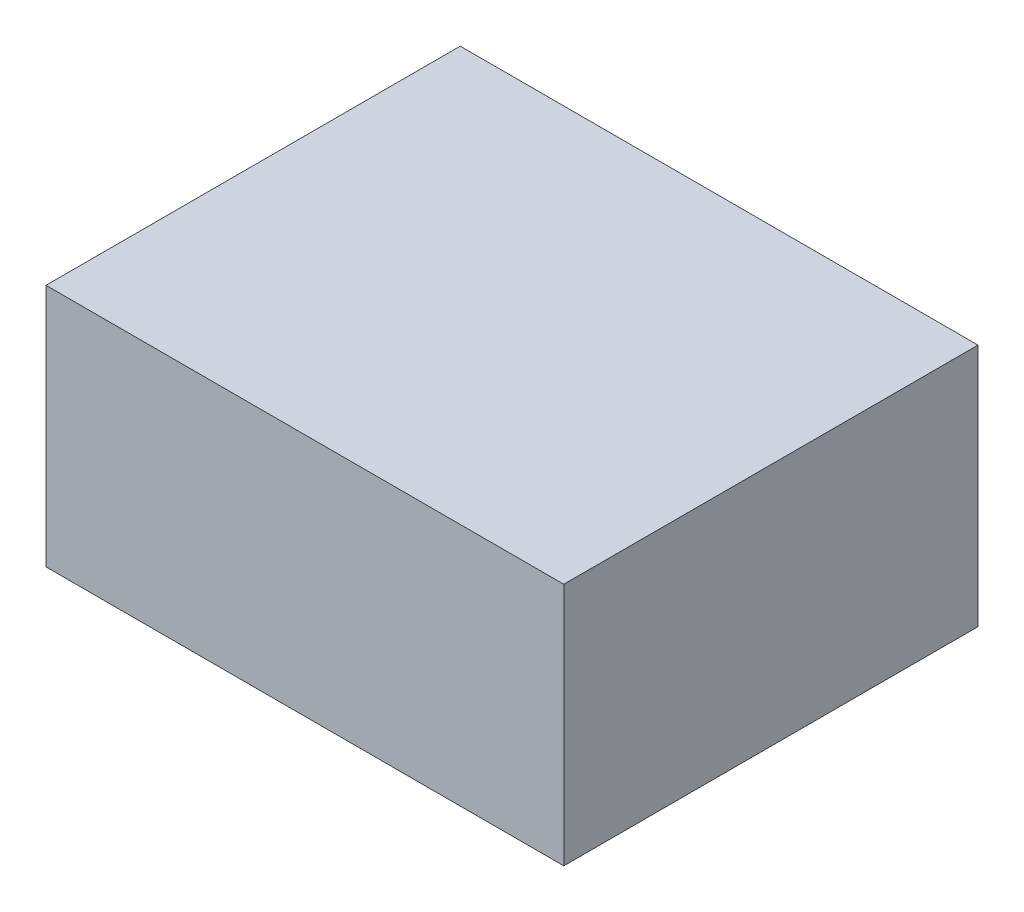
ISO-10303-21;
HEADER;
FILE_DESCRIPTION(('STEP AP214'),'2;1');
FILE_NAME('part.step','',(''),(''),'','','');
FILE_SCHEMA(('AUTOMOTIVE_DESIGN { 1 0 10303 214 1 1 1 1 }'));
ENDSEC;
DATA;
#1=APPLICATION_CONTEXT('core data for automotive mechanical design processes');
#2=APPLICATION_PROTOCOL_DEFINITION('international standard','automotive_design',2000,#1);
#3=PRODUCT_CONTEXT('',#1,'mechanical');
#4=PRODUCT('Part','Part','',(#3));
#5=PRODUCT_RELATED_PRODUCT_CATEGORY('part','',(#4));
#6=PRODUCT_DEFINITION_FORMATION('','',#4);
#7=PRODUCT_DEFINITION_CONTEXT('part definition',#1,'design');
#8=PRODUCT_DEFINITION('design','',#6,#7);
#9=PRODUCT_DEFINITION_SHAPE('','',#8);
#10=(LENGTH_UNIT() NAMED_UNIT(*) SI_UNIT(.MILLI.,.METRE.));
#11=(NAMED_UNIT(*) PLANE_ANGLE_UNIT() SI_UNIT($,.RADIAN.));
#12=(NAMED_UNIT(*) SI_UNIT($,.STERADIAN.) SOLID_ANGLE_UNIT());
#13=UNCERTAINTY_MEASURE_WITH_UNIT(LENGTH_MEASURE(1.E-05),#10,'distance_accuracy_value','');
#14=(GEOMETRIC_REPRESENTATION_CONTEXT(3) GLOBAL_UNCERTAINTY_ASSIGNED_CONTEXT((#13)) GLOBAL_UNIT_ASSIGNED_CONTEXT((#10,
#11,#12)) REPRESENTATION_CONTEXT('',''));
#15=CARTESIAN_POINT('',(0.,0.,0.));
#16=DIRECTION('',(0.,0.,1.));
#17=DIRECTION('',(1.,0.,0.));
#18=AXIS2_PLACEMENT_3D('',#15,#16,#17);
#19=CARTESIAN_POINT('',(0.,478.536,0.));
#20=DIRECTION('',(1.,0.,0.));
#21=DIRECTION('',(0.,0.,-1.));
#22=AXIS2_PLACEMENT_3D('',#19,#20,#21);
#23=PLANE('',#22);
#24=DIRECTION('',(0.,0.,1.));
#25=VECTOR('',#24,1.);
#26=CARTESIAN_POINT('',(0.,0.,0.));
#27=LINE('',#26,#25);
#28=CARTESIAN_POINT('',(0.,0.,-812.8));
#29=VERTEX_POINT('',#28);
#30=CARTESIAN_POINT('',(0.,0.,0.));
#31=VERTEX_POINT('',#30);
#32=EDGE_CURVE('E96',#29,#31,#27,.T.);
#33=ORIENTED_EDGE('',*,*,#32,.T.);
#34=DIRECTION('',(0.,-1.,0.));
#35=VECTOR('',#34,1.);
#36=CARTESIAN_POINT('',(0.,478.536,0.));
#37=LINE('',#36,#35);
#38=CARTESIAN_POINT('',(0.,478.536,0.));
#39=VERTEX_POINT('',#38);
#40=EDGE_CURVE('E11',#39,#31,#37,.T.);
#41=ORIENTED_EDGE('',*,*,#40,.F.);
#42=DIRECTION('',(0.,0.,1.));
#43=VECTOR('',#42,1.);
#44=CARTESIAN_POINT('',(0.,478.536,0.));
#45=LINE('',#44,#43);
#46=CARTESIAN_POINT('',(0.,478.536,-812.8));
#47=VERTEX_POINT('',#46);
#48=EDGE_CURVE('E84',#47,#39,#45,.T.);
#49=ORIENTED_EDGE('',*,*,#48,.F.);
#50=DIRECTION('',(0.,-1.,0.));
#51=VECTOR('',#50,1.);
#52=CARTESIAN_POINT('',(0.,478.536,-812.8));
#53=LINE('',#52,#51);
#54=EDGE_CURVE('E92',#47,#29,#53,.T.);
#55=ORIENTED_EDGE('',*,*,#54,.T.);
#56=EDGE_LOOP('',(#33,#41,#49,#55));
#57=FACE_BOUND('',#56,.T.);
#58=ADVANCED_FACE('F33',(#57),#23,.F.);
#59=CARTESIAN_POINT('',(0.,478.536,0.));
#60=DIRECTION('',(0.,0.,-1.));
#61=DIRECTION('',(-1.,0.,0.));
#62=AXIS2_PLACEMENT_3D('',#59,#60,#61);
#63=PLANE('',#62);
#64=DIRECTION('',(1.,0.,0.));
#65=VECTOR('',#64,1.);
#66=CARTESIAN_POINT('',(0.,0.,0.));
#67=LINE('',#66,#65);
#68=CARTESIAN_POINT('',(1016.,0.,0.));
#69=VERTEX_POINT('',#68);
#70=EDGE_CURVE('E88',#31,#69,#67,.T.);
#71=ORIENTED_EDGE('',*,*,#70,.T.);
#72=DIRECTION('',(0.,-1.,0.));
#73=VECTOR('',#72,1.);
#74=CARTESIAN_POINT('',(1016.,478.536,0.));
#75=LINE('',#74,#73);
#76=CARTESIAN_POINT('',(1016.,478.536,0.));
#77=VERTEX_POINT('',#76);
#78=EDGE_CURVE('E41',#77,#69,#75,.T.);
#79=ORIENTED_EDGE('',*,*,#78,.F.);
#80=DIRECTION('',(1.,0.,0.));
#81=VECTOR('',#80,1.);
#82=CARTESIAN_POINT('',(0.,478.536,0.));
#83=LINE('',#82,#81);
#84=EDGE_CURVE('E79',#39,#77,#83,.T.);
#85=ORIENTED_EDGE('',*,*,#84,.F.);
#86=ORIENTED_EDGE('',*,*,#40,.T.);
#87=EDGE_LOOP('',(#71,#79,#85,#86));
#88=FACE_BOUND('',#87,.T.);
#89=ADVANCED_FACE('F87',(#88),#63,.F.);
#90=CARTESIAN_POINT('',(1016.,478.536,0.));
#91=DIRECTION('',(-1.,0.,0.));
#92=DIRECTION('',(0.,0.,1.));
#93=AXIS2_PLACEMENT_3D('',#90,#91,#92);
#94=PLANE('',#93);
#95=DIRECTION('',(0.,0.,-1.));
#96=VECTOR('',#95,1.);
#97=CARTESIAN_POINT('',(1016.,0.,0.));
#98=LINE('',#97,#96);
#99=CARTESIAN_POINT('',(1016.,0.,-812.8));
#100=VERTEX_POINT('',#99);
#101=EDGE_CURVE('E66',#69,#100,#98,.T.);
#102=ORIENTED_EDGE('',*,*,#101,.T.);
#103=DIRECTION('',(0.,-1.,0.));
#104=VECTOR('',#103,1.);
#105=CARTESIAN_POINT('',(1016.,478.536,-812.8));
#106=LINE('',#105,#104);
#107=CARTESIAN_POINT('',(1016.,478.536,-812.8));
#108=VERTEX_POINT('',#107);
#109=EDGE_CURVE('E89',#108,#100,#106,.T.);
#110=ORIENTED_EDGE('',*,*,#109,.F.);
#111=DIRECTION('',(0.,0.,-1.));
#112=VECTOR('',#111,1.);
#113=CARTESIAN_POINT('',(1016.,478.536,0.));
#114=LINE('',#113,#112);
#115=EDGE_CURVE('E82',#77,#108,#114,.T.);
#116=ORIENTED_EDGE('',*,*,#115,.F.);
#117=ORIENTED_EDGE('',*,*,#78,.T.);
#118=EDGE_LOOP('',(#102,#110,#116,#117));
#119=FACE_BOUND('',#118,.T.);
#120=ADVANCED_FACE('F90',(#119),#94,.F.);
#121=CARTESIAN_POINT('',(0.,478.536,-812.8));
#122=DIRECTION('',(0.,0.,1.));
#123=DIRECTION('',(1.,0.,0.));
#124=AXIS2_PLACEMENT_3D('',#121,#122,#123);
#125=PLANE('',#124);
#126=DIRECTION('',(-1.,0.,0.));
#127=VECTOR('',#126,1.);
#128=CARTESIAN_POINT('',(0.,0.,-812.8));
#129=LINE('',#128,#127);
#130=EDGE_CURVE('E72',#100,#29,#129,.T.);
#131=ORIENTED_EDGE('',*,*,#130,.T.);
#132=ORIENTED_EDGE('',*,*,#54,.F.);
#133=DIRECTION('',(-1.,0.,0.));
#134=VECTOR('',#133,1.);
#135=CARTESIAN_POINT('',(0.,478.536,-812.8));
#136=LINE('',#135,#134);
#137=EDGE_CURVE('E49',#108,#47,#136,.T.);
#138=ORIENTED_EDGE('',*,*,#137,.F.);
#139=ORIENTED_EDGE('',*,*,#109,.T.);
#140=EDGE_LOOP('',(#131,#132,#138,#139));
#141=FACE_BOUND('',#140,.T.);
#142=ADVANCED_FACE('F103',(#141),#125,.F.);
#143=CARTESIAN_POINT('',(0.,478.536,0.));
#144=DIRECTION('',(0.,-1.,0.));
#145=DIRECTION('',(0.,0.,-1.));
#146=AXIS2_PLACEMENT_3D('',#143,#144,#145);
#147=PLANE('',#146);
#148=ORIENTED_EDGE('',*,*,#48,.T.);
#149=ORIENTED_EDGE('',*,*,#84,.T.);
#150=ORIENTED_EDGE('',*,*,#115,.T.);
#151=ORIENTED_EDGE('',*,*,#137,.T.);
#152=EDGE_LOOP('',(#148,#149,#150,#151));
#153=FACE_BOUND('',#152,.T.);
#154=ADVANCED_FACE('F80',(#153),#147,.F.);
#155=CARTESIAN_POINT('',(0.,0.,0.));
#156=DIRECTION('',(0.,-1.,0.));
#157=DIRECTION('',(0.,0.,-1.));
#158=AXIS2_PLACEMENT_3D('',#155,#156,#157);
#159=PLANE('',#158);
#160=ORIENTED_EDGE('',*,*,#32,.F.);
#161=ORIENTED_EDGE('',*,*,#130,.F.);
#162=ORIENTED_EDGE('',*,*,#101,.F.);
#163=ORIENTED_EDGE('',*,*,#70,.F.);
#164=EDGE_LOOP('',(#160,#161,#162,#163));
#165=FACE_BOUND('',#164,.T.);
#166=ADVANCED_FACE('F106',(#165),#159,.T.);
#167=CLOSED_SHELL('',(#58,#89,#120,#142,#154,#166));
#168=MANIFOLD_SOLID_BREP('B2',#167);
#169=ADVANCED_BREP_SHAPE_REPRESENTATION('',(#18,#168),#14);
#170=SHAPE_DEFINITION_REPRESENTATION(#9,#169);
ENDSEC;
END-ISO-10303-21;
